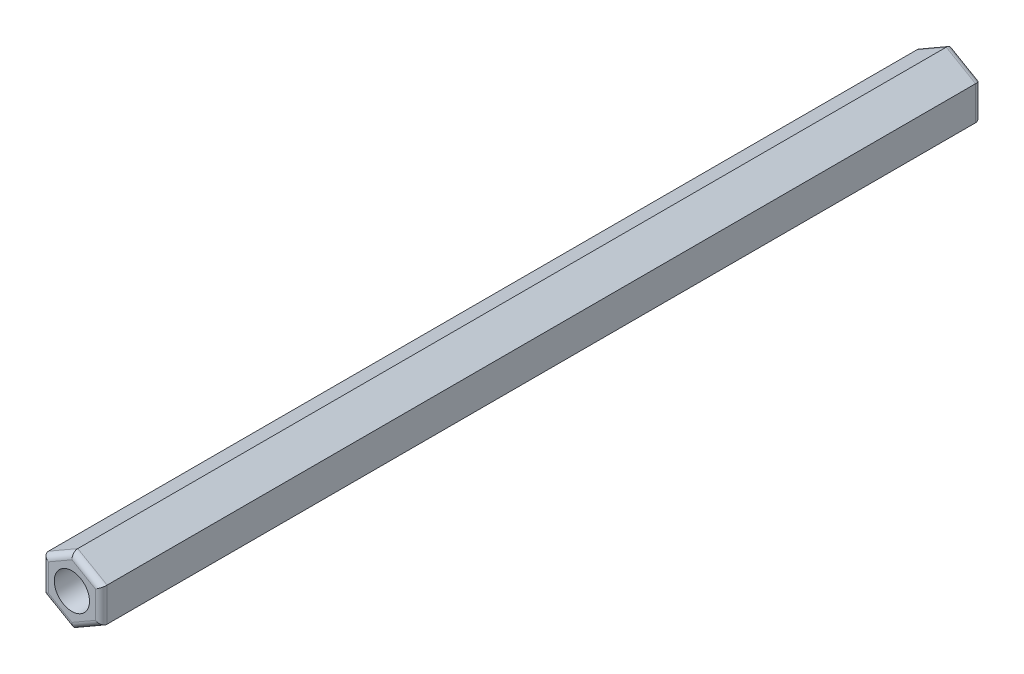
ISO-10303-21;
HEADER;
FILE_DESCRIPTION(('STEP AP214'),'2;1');
FILE_NAME('part.step','',(''),(''),'','','');
FILE_SCHEMA(('AUTOMOTIVE_DESIGN { 1 0 10303 214 1 1 1 1 }'));
ENDSEC;
DATA;
#1=APPLICATION_CONTEXT('core data for automotive mechanical design processes');
#2=APPLICATION_PROTOCOL_DEFINITION('international standard','automotive_design',2000,#1);
#3=PRODUCT_CONTEXT('',#1,'mechanical');
#4=PRODUCT('Part','Part','',(#3));
#5=PRODUCT_RELATED_PRODUCT_CATEGORY('part','',(#4));
#6=PRODUCT_DEFINITION_FORMATION('','',#4);
#7=PRODUCT_DEFINITION_CONTEXT('part definition',#1,'design');
#8=PRODUCT_DEFINITION('design','',#6,#7);
#9=PRODUCT_DEFINITION_SHAPE('','',#8);
#10=(LENGTH_UNIT() NAMED_UNIT(*) SI_UNIT(.MILLI.,.METRE.));
#11=(NAMED_UNIT(*) PLANE_ANGLE_UNIT() SI_UNIT($,.RADIAN.));
#12=(NAMED_UNIT(*) SI_UNIT($,.STERADIAN.) SOLID_ANGLE_UNIT());
#13=UNCERTAINTY_MEASURE_WITH_UNIT(LENGTH_MEASURE(1.E-05),#10,'distance_accuracy_value','');
#14=(GEOMETRIC_REPRESENTATION_CONTEXT(3) GLOBAL_UNCERTAINTY_ASSIGNED_CONTEXT((#13)) GLOBAL_UNIT_ASSIGNED_CONTEXT((#10,
#11,#12)) REPRESENTATION_CONTEXT('',''));
#15=CARTESIAN_POINT('',(0.,0.,0.));
#16=DIRECTION('',(0.,0.,1.));
#17=DIRECTION('',(1.,0.,0.));
#18=AXIS2_PLACEMENT_3D('',#15,#16,#17);
#19=CARTESIAN_POINT('',(-67.50212267549,1.44337567297406,75.));
#20=DIRECTION('',(1.,0.,0.));
#21=DIRECTION('',(0.,0.,-1.));
#22=AXIS2_PLACEMENT_3D('',#19,#20,#21);
#23=PLANE('',#22);
#24=DIRECTION('',(0.,0.,-1.));
#25=VECTOR('',#24,1.);
#26=CARTESIAN_POINT('',(-67.50212267549,-1.44337567297407,75.));
#27=LINE('',#26,#25);
#28=CARTESIAN_POINT('',(-67.50212267549,-1.44337567297407,74.5));
#29=VERTEX_POINT('',#28);
#30=CARTESIAN_POINT('',(-67.50212267549,-1.44337567297407,0.5));
#31=VERTEX_POINT('',#30);
#32=EDGE_CURVE('E152',#29,#31,#27,.T.);
#33=ORIENTED_EDGE('',*,*,#32,.T.);
#34=DIRECTION('',(0.,-1.,0.));
#35=VECTOR('',#34,1.);
#36=CARTESIAN_POINT('',(-67.50212267549,1.44337567297406,0.5));
#37=LINE('',#36,#35);
#38=CARTESIAN_POINT('',(-67.50212267549,1.44337567297406,0.5));
#39=VERTEX_POINT('',#38);
#40=EDGE_CURVE('E149',#31,#39,#37,.F.);
#41=ORIENTED_EDGE('',*,*,#40,.T.);
#42=DIRECTION('',(0.,0.,-1.));
#43=VECTOR('',#42,1.);
#44=CARTESIAN_POINT('',(-67.50212267549,1.44337567297406,75.));
#45=LINE('',#44,#43);
#46=CARTESIAN_POINT('',(-67.50212267549,1.44337567297406,74.5));
#47=VERTEX_POINT('',#46);
#48=EDGE_CURVE('E146',#47,#39,#45,.T.);
#49=ORIENTED_EDGE('',*,*,#48,.F.);
#50=DIRECTION('',(0.,-1.,0.));
#51=VECTOR('',#50,1.);
#52=CARTESIAN_POINT('',(-67.50212267549,-1.44337567297407,74.5));
#53=LINE('',#52,#51);
#54=EDGE_CURVE('E206',#47,#29,#53,.T.);
#55=ORIENTED_EDGE('',*,*,#54,.T.);
#56=EDGE_LOOP('',(#33,#41,#49,#55));
#57=FACE_BOUND('',#56,.T.);
#58=ADVANCED_FACE('F32',(#57),#23,.T.);
#59=CARTESIAN_POINT('',(-70.00212267549,2.88675134594811,75.));
#60=DIRECTION('',(0.5,0.866025403784439,0.));
#61=DIRECTION('',(-0.866025403784439,0.5,0.));
#62=AXIS2_PLACEMENT_3D('',#59,#60,#61);
#63=PLANE('',#62);
#64=ORIENTED_EDGE('',*,*,#48,.T.);
#65=DIRECTION('',(0.866025403784439,-0.5,0.));
#66=VECTOR('',#65,1.);
#67=CARTESIAN_POINT('',(-70.00212267549,2.88675134594811,0.5));
#68=LINE('',#67,#66);
#69=CARTESIAN_POINT('',(-70.00212267549,2.88675134594811,0.5));
#70=VERTEX_POINT('',#69);
#71=EDGE_CURVE('E191',#39,#70,#68,.F.);
#72=ORIENTED_EDGE('',*,*,#71,.T.);
#73=DIRECTION('',(0.,0.,-1.));
#74=VECTOR('',#73,1.);
#75=CARTESIAN_POINT('',(-70.00212267549,2.88675134594811,75.));
#76=LINE('',#75,#74);
#77=CARTESIAN_POINT('',(-70.00212267549,2.88675134594811,74.5));
#78=VERTEX_POINT('',#77);
#79=EDGE_CURVE('E255',#78,#70,#76,.T.);
#80=ORIENTED_EDGE('',*,*,#79,.F.);
#81=DIRECTION('',(0.866025403784439,-0.5,0.));
#82=VECTOR('',#81,1.);
#83=CARTESIAN_POINT('',(-67.50212267549,1.44337567297406,74.5));
#84=LINE('',#83,#82);
#85=EDGE_CURVE('E197',#78,#47,#84,.T.);
#86=ORIENTED_EDGE('',*,*,#85,.T.);
#87=EDGE_LOOP('',(#64,#72,#80,#86));
#88=FACE_BOUND('',#87,.T.);
#89=ADVANCED_FACE('F284',(#88),#63,.T.);
#90=CARTESIAN_POINT('',(-72.50212267549,1.44337567297405,75.));
#91=DIRECTION('',(-0.5,0.866025403784438,0.));
#92=DIRECTION('',(-0.866025403784439,-0.5,0.));
#93=AXIS2_PLACEMENT_3D('',#90,#91,#92);
#94=PLANE('',#93);
#95=ORIENTED_EDGE('',*,*,#79,.T.);
#96=DIRECTION('',(0.866025403784439,0.5,0.));
#97=VECTOR('',#96,1.);
#98=CARTESIAN_POINT('',(-72.50212267549,1.44337567297405,0.5));
#99=LINE('',#98,#97);
#100=CARTESIAN_POINT('',(-72.50212267549,1.44337567297405,0.5));
#101=VERTEX_POINT('',#100);
#102=EDGE_CURVE('E231',#70,#101,#99,.F.);
#103=ORIENTED_EDGE('',*,*,#102,.T.);
#104=DIRECTION('',(0.,0.,-1.));
#105=VECTOR('',#104,1.);
#106=CARTESIAN_POINT('',(-72.50212267549,1.44337567297405,75.));
#107=LINE('',#106,#105);
#108=CARTESIAN_POINT('',(-72.50212267549,1.44337567297405,74.5));
#109=VERTEX_POINT('',#108);
#110=EDGE_CURVE('E253',#109,#101,#107,.T.);
#111=ORIENTED_EDGE('',*,*,#110,.F.);
#112=DIRECTION('',(0.866025403784439,0.5,0.));
#113=VECTOR('',#112,1.);
#114=CARTESIAN_POINT('',(-70.00212267549,2.88675134594811,74.5));
#115=LINE('',#114,#113);
#116=EDGE_CURVE('E234',#109,#78,#115,.T.);
#117=ORIENTED_EDGE('',*,*,#116,.T.);
#118=EDGE_LOOP('',(#95,#103,#111,#117));
#119=FACE_BOUND('',#118,.T.);
#120=ADVANCED_FACE('F290',(#119),#94,.T.);
#121=CARTESIAN_POINT('',(-72.50212267549,-1.44337567297407,75.));
#122=DIRECTION('',(-1.,0.,0.));
#123=DIRECTION('',(0.,0.,1.));
#124=AXIS2_PLACEMENT_3D('',#121,#122,#123);
#125=PLANE('',#124);
#126=ORIENTED_EDGE('',*,*,#110,.T.);
#127=DIRECTION('',(0.,1.,0.));
#128=VECTOR('',#127,1.);
#129=CARTESIAN_POINT('',(-72.50212267549,-1.44337567297407,0.5));
#130=LINE('',#129,#128);
#131=CARTESIAN_POINT('',(-72.50212267549,-1.44337567297407,0.5));
#132=VERTEX_POINT('',#131);
#133=EDGE_CURVE('E201',#101,#132,#130,.F.);
#134=ORIENTED_EDGE('',*,*,#133,.T.);
#135=DIRECTION('',(0.,0.,-1.));
#136=VECTOR('',#135,1.);
#137=CARTESIAN_POINT('',(-72.50212267549,-1.44337567297407,75.));
#138=LINE('',#137,#136);
#139=CARTESIAN_POINT('',(-72.50212267549,-1.44337567297407,74.5));
#140=VERTEX_POINT('',#139);
#141=EDGE_CURVE('E250',#140,#132,#138,.T.);
#142=ORIENTED_EDGE('',*,*,#141,.F.);
#143=DIRECTION('',(0.,1.,0.));
#144=VECTOR('',#143,1.);
#145=CARTESIAN_POINT('',(-72.50212267549,1.44337567297405,74.5));
#146=LINE('',#145,#144);
#147=EDGE_CURVE('E226',#140,#109,#146,.T.);
#148=ORIENTED_EDGE('',*,*,#147,.T.);
#149=EDGE_LOOP('',(#126,#134,#142,#148));
#150=FACE_BOUND('',#149,.T.);
#151=ADVANCED_FACE('F341',(#150),#125,.T.);
#152=CARTESIAN_POINT('',(-70.00212267549,-2.88675134594813,75.));
#153=DIRECTION('',(-0.499999999999999,-0.866025403784439,0.));
#154=DIRECTION('',(0.866025403784439,-0.499999999999999,0.));
#155=AXIS2_PLACEMENT_3D('',#152,#153,#154);
#156=PLANE('',#155);
#157=ORIENTED_EDGE('',*,*,#141,.T.);
#158=DIRECTION('',(-0.866025403784439,0.499999999999999,0.));
#159=VECTOR('',#158,1.);
#160=CARTESIAN_POINT('',(-70.00212267549,-2.88675134594813,0.5));
#161=LINE('',#160,#159);
#162=CARTESIAN_POINT('',(-70.00212267549,-2.88675134594813,0.5));
#163=VERTEX_POINT('',#162);
#164=EDGE_CURVE('E199',#132,#163,#161,.F.);
#165=ORIENTED_EDGE('',*,*,#164,.T.);
#166=DIRECTION('',(0.,0.,-1.));
#167=VECTOR('',#166,1.);
#168=CARTESIAN_POINT('',(-70.00212267549,-2.88675134594813,75.));
#169=LINE('',#168,#167);
#170=CARTESIAN_POINT('',(-70.00212267549,-2.88675134594813,74.5));
#171=VERTEX_POINT('',#170);
#172=EDGE_CURVE('E247',#171,#163,#169,.T.);
#173=ORIENTED_EDGE('',*,*,#172,.F.);
#174=DIRECTION('',(-0.866025403784439,0.499999999999999,0.));
#175=VECTOR('',#174,1.);
#176=CARTESIAN_POINT('',(-72.50212267549,-1.44337567297407,74.5));
#177=LINE('',#176,#175);
#178=EDGE_CURVE('E196',#171,#140,#177,.T.);
#179=ORIENTED_EDGE('',*,*,#178,.T.);
#180=EDGE_LOOP('',(#157,#165,#173,#179));
#181=FACE_BOUND('',#180,.T.);
#182=ADVANCED_FACE('F280',(#181),#156,.T.);
#183=CARTESIAN_POINT('',(-67.50212267549,-1.44337567297407,75.));
#184=DIRECTION('',(0.500000000000001,-0.866025403784438,0.));
#185=DIRECTION('',(0.866025403784438,0.500000000000001,0.));
#186=AXIS2_PLACEMENT_3D('',#183,#184,#185);
#187=PLANE('',#186);
#188=ORIENTED_EDGE('',*,*,#172,.T.);
#189=DIRECTION('',(-0.866025403784438,-0.500000000000001,0.));
#190=VECTOR('',#189,1.);
#191=CARTESIAN_POINT('',(-67.50212267549,-1.44337567297407,0.5));
#192=LINE('',#191,#190);
#193=EDGE_CURVE('E211',#163,#31,#192,.F.);
#194=ORIENTED_EDGE('',*,*,#193,.T.);
#195=ORIENTED_EDGE('',*,*,#32,.F.);
#196=DIRECTION('',(-0.866025403784438,-0.500000000000001,0.));
#197=VECTOR('',#196,1.);
#198=CARTESIAN_POINT('',(-70.00212267549,-2.88675134594813,74.5));
#199=LINE('',#198,#197);
#200=EDGE_CURVE('E209',#29,#171,#199,.T.);
#201=ORIENTED_EDGE('',*,*,#200,.T.);
#202=EDGE_LOOP('',(#188,#194,#195,#201));
#203=FACE_BOUND('',#202,.T.);
#204=ADVANCED_FACE('F273',(#203),#187,.T.);
#205=CARTESIAN_POINT('',(0.,0.,75.));
#206=DIRECTION('',(0.,0.,-1.));
#207=DIRECTION('',(-1.,0.,0.));
#208=AXIS2_PLACEMENT_3D('',#205,#206,#207);
#209=PLANE('',#208);
#210=CARTESIAN_POINT('',(-70.00212267549,0.,75.));
#211=DIRECTION('',(0.,0.,1.));
#212=DIRECTION('',(1.,0.,0.));
#213=AXIS2_PLACEMENT_3D('',#210,#211,#212);
#214=CIRCLE('',#213,1.5);
#215=CARTESIAN_POINT('',(-68.50212267549,0.,75.));
#216=VERTEX_POINT('',#215);
#217=EDGE_CURVE('E258',#216,#216,#214,.T.);
#218=ORIENTED_EDGE('',*,*,#217,.F.);
#219=EDGE_LOOP('',(#218));
#220=FACE_BOUND('',#219,.T.);
#221=DIRECTION('',(0.866025403784439,-0.5,0.));
#222=VECTOR('',#221,1.);
#223=CARTESIAN_POINT('',(-70.25212267549,2.45373864405589,75.));
#224=LINE('',#223,#222);
#225=CARTESIAN_POINT('',(-68.00212267549,1.15470053837924,75.));
#226=VERTEX_POINT('',#225);
#227=CARTESIAN_POINT('',(-70.00212267549,2.30940107675849,75.));
#228=VERTEX_POINT('',#227);
#229=EDGE_CURVE('E56',#226,#228,#224,.F.);
#230=ORIENTED_EDGE('',*,*,#229,.T.);
#231=DIRECTION('',(0.866025403784439,0.5,0.));
#232=VECTOR('',#231,1.);
#233=CARTESIAN_POINT('',(-72.25212267549,1.01036297108183,75.));
#234=LINE('',#233,#232);
#235=CARTESIAN_POINT('',(-72.00212267549,1.15470053837923,75.));
#236=VERTEX_POINT('',#235);
#237=EDGE_CURVE('E11',#228,#236,#234,.F.);
#238=ORIENTED_EDGE('',*,*,#237,.T.);
#239=DIRECTION('',(0.,1.,0.));
#240=VECTOR('',#239,1.);
#241=CARTESIAN_POINT('',(-72.00212267549,-1.44337567297407,75.));
#242=LINE('',#241,#240);
#243=CARTESIAN_POINT('',(-72.00212267549,-1.15470053837925,75.));
#244=VERTEX_POINT('',#243);
#245=EDGE_CURVE('E41',#236,#244,#242,.F.);
#246=ORIENTED_EDGE('',*,*,#245,.T.);
#247=DIRECTION('',(-0.866025403784439,0.499999999999999,0.));
#248=VECTOR('',#247,1.);
#249=CARTESIAN_POINT('',(-69.75212267549,-2.45373864405591,75.));
#250=LINE('',#249,#248);
#251=CARTESIAN_POINT('',(-70.00212267549,-2.3094010767585,75.));
#252=VERTEX_POINT('',#251);
#253=EDGE_CURVE('E217',#244,#252,#250,.F.);
#254=ORIENTED_EDGE('',*,*,#253,.T.);
#255=DIRECTION('',(-0.866025403784438,-0.500000000000001,0.));
#256=VECTOR('',#255,1.);
#257=CARTESIAN_POINT('',(-67.75212267549,-1.01036297108185,75.));
#258=LINE('',#257,#256);
#259=CARTESIAN_POINT('',(-68.00212267549,-1.15470053837926,75.));
#260=VERTEX_POINT('',#259);
#261=EDGE_CURVE('E213',#252,#260,#258,.F.);
#262=ORIENTED_EDGE('',*,*,#261,.T.);
#263=DIRECTION('',(0.,-1.,0.));
#264=VECTOR('',#263,1.);
#265=CARTESIAN_POINT('',(-68.00212267549,1.44337567297406,75.));
#266=LINE('',#265,#264);
#267=EDGE_CURVE('E215',#260,#226,#266,.F.);
#268=ORIENTED_EDGE('',*,*,#267,.T.);
#269=EDGE_LOOP('',(#230,#238,#246,#254,#262,#268));
#270=FACE_BOUND('',#269,.T.);
#271=ADVANCED_FACE('F219',(#220,#270),#209,.F.);
#272=CARTESIAN_POINT('',(0.,0.,0.));
#273=DIRECTION('',(0.,0.,-1.));
#274=DIRECTION('',(-1.,0.,0.));
#275=AXIS2_PLACEMENT_3D('',#272,#273,#274);
#276=PLANE('',#275);
#277=CARTESIAN_POINT('',(-70.00212267549,0.,0.));
#278=DIRECTION('',(0.,0.,1.));
#279=DIRECTION('',(1.,0.,0.));
#280=AXIS2_PLACEMENT_3D('',#277,#278,#279);
#281=CIRCLE('',#280,1.5);
#282=CARTESIAN_POINT('',(-68.50212267549,0.,0.));
#283=VERTEX_POINT('',#282);
#284=EDGE_CURVE('E161',#283,#283,#281,.T.);
#285=ORIENTED_EDGE('',*,*,#284,.T.);
#286=EDGE_LOOP('',(#285));
#287=FACE_BOUND('',#286,.T.);
#288=DIRECTION('',(0.,1.,0.));
#289=VECTOR('',#288,1.);
#290=CARTESIAN_POINT('',(-72.00212267549,0.,0.));
#291=LINE('',#290,#289);
#292=CARTESIAN_POINT('',(-72.00212267549,-1.15470053837926,0.));
#293=VERTEX_POINT('',#292);
#294=CARTESIAN_POINT('',(-72.00212267549,1.15470053837924,0.));
#295=VERTEX_POINT('',#294);
#296=EDGE_CURVE('E241',#293,#295,#291,.T.);
#297=ORIENTED_EDGE('',*,*,#296,.T.);
#298=DIRECTION('',(0.866025403784439,0.5,0.));
#299=VECTOR('',#298,1.);
#300=CARTESIAN_POINT('',(-18.5005306688725,32.0438590854734,0.));
#301=LINE('',#300,#299);
#302=CARTESIAN_POINT('',(-70.00212267549,2.30940107675849,0.));
#303=VERTEX_POINT('',#302);
#304=EDGE_CURVE('E239',#295,#303,#301,.T.);
#305=ORIENTED_EDGE('',*,*,#304,.T.);
#306=DIRECTION('',(0.866025403784439,-0.5,0.));
#307=VECTOR('',#306,1.);
#308=CARTESIAN_POINT('',(-16.5005306688725,-28.5797574703356,0.));
#309=LINE('',#308,#307);
#310=CARTESIAN_POINT('',(-68.00212267549,1.15470053837924,0.));
#311=VERTEX_POINT('',#310);
#312=EDGE_CURVE('E130',#303,#311,#309,.T.);
#313=ORIENTED_EDGE('',*,*,#312,.T.);
#314=DIRECTION('',(0.,-1.,0.));
#315=VECTOR('',#314,1.);
#316=CARTESIAN_POINT('',(-68.00212267549,0.,0.));
#317=LINE('',#316,#315);
#318=CARTESIAN_POINT('',(-68.00212267549,-1.15470053837925,0.));
#319=VERTEX_POINT('',#318);
#320=EDGE_CURVE('E123',#311,#319,#317,.T.);
#321=ORIENTED_EDGE('',*,*,#320,.T.);
#322=DIRECTION('',(-0.866025403784438,-0.500000000000001,0.));
#323=VECTOR('',#322,1.);
#324=CARTESIAN_POINT('',(-16.5005306688726,28.5797574703357,0.));
#325=LINE('',#324,#323);
#326=CARTESIAN_POINT('',(-70.00212267549,-2.30940107675851,0.));
#327=VERTEX_POINT('',#326);
#328=EDGE_CURVE('E126',#319,#327,#325,.T.);
#329=ORIENTED_EDGE('',*,*,#328,.T.);
#330=DIRECTION('',(-0.866025403784439,0.499999999999999,0.));
#331=VECTOR('',#330,1.);
#332=CARTESIAN_POINT('',(-18.5005306688724,-32.0438590854734,0.));
#333=LINE('',#332,#331);
#334=EDGE_CURVE('E135',#327,#293,#333,.T.);
#335=ORIENTED_EDGE('',*,*,#334,.T.);
#336=EDGE_LOOP('',(#297,#305,#313,#321,#329,#335));
#337=FACE_BOUND('',#336,.T.);
#338=ADVANCED_FACE('F125',(#287,#337),#276,.T.);
#339=CARTESIAN_POINT('',(-16.5005306688726,28.5797574703357,0.5));
#340=DIRECTION('',(-0.866025403784438,-0.500000000000001,0.));
#341=DIRECTION('',(0.500000000000001,-0.866025403784438,0.));
#342=AXIS2_PLACEMENT_3D('',#339,#340,#341);
#343=CYLINDRICAL_SURFACE('',#342,0.5);
#344=CARTESIAN_POINT('',(-68.00212267549,-1.15470053837925,0.5));
#345=DIRECTION('',(-0.5,-0.866025403784439,0.));
#346=DIRECTION('',(-0.866025403784439,0.5,0.));
#347=AXIS2_PLACEMENT_3D('',#344,#345,#346);
#348=ELLIPSE('',#347,0.577350269189626,0.5);
#349=EDGE_CURVE('E141',#31,#319,#348,.F.);
#350=ORIENTED_EDGE('',*,*,#349,.F.);
#351=ORIENTED_EDGE('',*,*,#193,.F.);
#352=CARTESIAN_POINT('',(-70.00212267549,-2.3094010767585,0.5));
#353=DIRECTION('',(-1.,0.,0.));
#354=DIRECTION('',(0.,-1.,0.));
#355=AXIS2_PLACEMENT_3D('',#352,#353,#354);
#356=ELLIPSE('',#355,0.577350269189626,0.5);
#357=EDGE_CURVE('E144',#327,#163,#356,.T.);
#358=ORIENTED_EDGE('',*,*,#357,.F.);
#359=ORIENTED_EDGE('',*,*,#328,.F.);
#360=EDGE_LOOP('',(#350,#351,#358,#359));
#361=FACE_BOUND('',#360,.T.);
#362=ADVANCED_FACE('F139',(#361),#343,.T.);
#363=CARTESIAN_POINT('',(-18.5005306688724,-32.0438590854734,0.5));
#364=DIRECTION('',(-0.866025403784439,0.499999999999999,0.));
#365=DIRECTION('',(-0.499999999999999,-0.866025403784439,0.));
#366=AXIS2_PLACEMENT_3D('',#363,#364,#365);
#367=CYLINDRICAL_SURFACE('',#366,0.5);
#368=ORIENTED_EDGE('',*,*,#357,.T.);
#369=ORIENTED_EDGE('',*,*,#164,.F.);
#370=CARTESIAN_POINT('',(-72.00212267549,-1.15470053837926,0.5));
#371=DIRECTION('',(-0.500000000000001,0.866025403784438,0.));
#372=DIRECTION('',(-0.866025403784438,-0.500000000000001,0.));
#373=AXIS2_PLACEMENT_3D('',#370,#371,#372);
#374=ELLIPSE('',#373,0.577350269189626,0.5);
#375=EDGE_CURVE('E150',#293,#132,#374,.T.);
#376=ORIENTED_EDGE('',*,*,#375,.F.);
#377=ORIENTED_EDGE('',*,*,#334,.F.);
#378=EDGE_LOOP('',(#368,#369,#376,#377));
#379=FACE_BOUND('',#378,.T.);
#380=ADVANCED_FACE('F305',(#379),#367,.T.);
#381=CARTESIAN_POINT('',(-68.00212267549,0.,0.5));
#382=DIRECTION('',(0.,-1.,0.));
#383=DIRECTION('',(0.,0.,-1.));
#384=AXIS2_PLACEMENT_3D('',#381,#382,#383);
#385=CYLINDRICAL_SURFACE('',#384,0.5);
#386=ORIENTED_EDGE('',*,*,#349,.T.);
#387=ORIENTED_EDGE('',*,*,#320,.F.);
#388=CARTESIAN_POINT('',(-68.00212267549,1.15470053837925,0.5));
#389=DIRECTION('',(0.5,-0.866025403784439,0.));
#390=DIRECTION('',(-0.866025403784439,-0.5,0.));
#391=AXIS2_PLACEMENT_3D('',#388,#389,#390);
#392=ELLIPSE('',#391,0.577350269189626,0.5);
#393=EDGE_CURVE('E155',#39,#311,#392,.F.);
#394=ORIENTED_EDGE('',*,*,#393,.F.);
#395=ORIENTED_EDGE('',*,*,#40,.F.);
#396=EDGE_LOOP('',(#386,#387,#394,#395));
#397=FACE_BOUND('',#396,.T.);
#398=ADVANCED_FACE('F148',(#397),#385,.T.);
#399=CARTESIAN_POINT('',(-72.00212267549,0.,0.5));
#400=DIRECTION('',(0.,1.,0.));
#401=DIRECTION('',(0.,0.,1.));
#402=AXIS2_PLACEMENT_3D('',#399,#400,#401);
#403=CYLINDRICAL_SURFACE('',#402,0.5);
#404=ORIENTED_EDGE('',*,*,#375,.T.);
#405=ORIENTED_EDGE('',*,*,#133,.F.);
#406=CARTESIAN_POINT('',(-72.00212267549,1.15470053837923,0.5));
#407=DIRECTION('',(0.5,0.866025403784439,0.));
#408=DIRECTION('',(-0.866025403784439,0.5,0.));
#409=AXIS2_PLACEMENT_3D('',#406,#407,#408);
#410=ELLIPSE('',#409,0.577350269189626,0.5);
#411=EDGE_CURVE('E180',#295,#101,#410,.T.);
#412=ORIENTED_EDGE('',*,*,#411,.F.);
#413=ORIENTED_EDGE('',*,*,#296,.F.);
#414=EDGE_LOOP('',(#404,#405,#412,#413));
#415=FACE_BOUND('',#414,.T.);
#416=ADVANCED_FACE('F299',(#415),#403,.T.);
#417=CARTESIAN_POINT('',(-16.5005306688725,-28.5797574703356,0.5));
#418=DIRECTION('',(0.866025403784439,-0.5,0.));
#419=DIRECTION('',(0.5,0.866025403784439,0.));
#420=AXIS2_PLACEMENT_3D('',#417,#418,#419);
#421=CYLINDRICAL_SURFACE('',#420,0.5);
#422=ORIENTED_EDGE('',*,*,#393,.T.);
#423=ORIENTED_EDGE('',*,*,#312,.F.);
#424=CARTESIAN_POINT('',(-70.00212267549,2.30940107675848,0.5));
#425=DIRECTION('',(1.,0.,0.));
#426=DIRECTION('',(0.,-1.,0.));
#427=AXIS2_PLACEMENT_3D('',#424,#425,#426);
#428=ELLIPSE('',#427,0.577350269189626,0.5);
#429=EDGE_CURVE('E175',#70,#303,#428,.F.);
#430=ORIENTED_EDGE('',*,*,#429,.F.);
#431=ORIENTED_EDGE('',*,*,#71,.F.);
#432=EDGE_LOOP('',(#422,#423,#430,#431));
#433=FACE_BOUND('',#432,.T.);
#434=ADVANCED_FACE('F190',(#433),#421,.T.);
#435=CARTESIAN_POINT('',(-18.5005306688725,32.0438590854734,0.5));
#436=DIRECTION('',(0.866025403784439,0.5,0.));
#437=DIRECTION('',(-0.5,0.866025403784438,0.));
#438=AXIS2_PLACEMENT_3D('',#435,#436,#437);
#439=CYLINDRICAL_SURFACE('',#438,0.5);
#440=ORIENTED_EDGE('',*,*,#411,.T.);
#441=ORIENTED_EDGE('',*,*,#102,.F.);
#442=ORIENTED_EDGE('',*,*,#429,.T.);
#443=ORIENTED_EDGE('',*,*,#304,.F.);
#444=EDGE_LOOP('',(#440,#441,#442,#443));
#445=FACE_BOUND('',#444,.T.);
#446=ADVANCED_FACE('F294',(#445),#439,.T.);
#447=CARTESIAN_POINT('',(-67.75212267549,-1.01036297108185,74.5));
#448=DIRECTION('',(0.866025403784438,0.500000000000001,0.));
#449=DIRECTION('',(-0.500000000000001,0.866025403784438,0.));
#450=AXIS2_PLACEMENT_3D('',#447,#448,#449);
#451=CYLINDRICAL_SURFACE('',#450,0.5);
#452=CARTESIAN_POINT('',(-68.00212267549,-1.15470053837926,74.5));
#453=DIRECTION('',(0.5,0.866025403784439,0.));
#454=DIRECTION('',(0.866025403784439,-0.5,0.));
#455=AXIS2_PLACEMENT_3D('',#452,#453,#454);
#456=ELLIPSE('',#455,0.577350269189626,0.5);
#457=EDGE_CURVE('E168',#260,#29,#456,.T.);
#458=ORIENTED_EDGE('',*,*,#457,.F.);
#459=ORIENTED_EDGE('',*,*,#261,.F.);
#460=CARTESIAN_POINT('',(-70.00212267549,-2.3094010767585,74.5));
#461=DIRECTION('',(1.,0.,0.));
#462=DIRECTION('',(0.,1.,0.));
#463=AXIS2_PLACEMENT_3D('',#460,#461,#462);
#464=ELLIPSE('',#463,0.577350269189626,0.5);
#465=EDGE_CURVE('E36',#171,#252,#464,.F.);
#466=ORIENTED_EDGE('',*,*,#465,.F.);
#467=ORIENTED_EDGE('',*,*,#200,.F.);
#468=EDGE_LOOP('',(#458,#459,#466,#467));
#469=FACE_BOUND('',#468,.T.);
#470=ADVANCED_FACE('F34',(#469),#451,.T.);
#471=CARTESIAN_POINT('',(-69.75212267549,-2.45373864405591,74.5));
#472=DIRECTION('',(0.866025403784439,-0.499999999999999,0.));
#473=DIRECTION('',(0.499999999999999,0.866025403784439,0.));
#474=AXIS2_PLACEMENT_3D('',#471,#472,#473);
#475=CYLINDRICAL_SURFACE('',#474,0.5);
#476=ORIENTED_EDGE('',*,*,#465,.T.);
#477=ORIENTED_EDGE('',*,*,#253,.F.);
#478=CARTESIAN_POINT('',(-72.00212267549,-1.15470053837925,74.5));
#479=DIRECTION('',(0.500000000000001,-0.866025403784438,0.));
#480=DIRECTION('',(0.866025403784438,0.500000000000001,0.));
#481=AXIS2_PLACEMENT_3D('',#478,#479,#480);
#482=ELLIPSE('',#481,0.577350269189626,0.5);
#483=EDGE_CURVE('E166',#140,#244,#482,.F.);
#484=ORIENTED_EDGE('',*,*,#483,.F.);
#485=ORIENTED_EDGE('',*,*,#178,.F.);
#486=EDGE_LOOP('',(#476,#477,#484,#485));
#487=FACE_BOUND('',#486,.T.);
#488=ADVANCED_FACE('F223',(#487),#475,.T.);
#489=CARTESIAN_POINT('',(-68.00212267549,1.44337567297406,74.5));
#490=DIRECTION('',(0.,1.,0.));
#491=DIRECTION('',(0.,0.,1.));
#492=AXIS2_PLACEMENT_3D('',#489,#490,#491);
#493=CYLINDRICAL_SURFACE('',#492,0.5);
#494=ORIENTED_EDGE('',*,*,#457,.T.);
#495=ORIENTED_EDGE('',*,*,#54,.F.);
#496=CARTESIAN_POINT('',(-68.00212267549,1.15470053837924,74.5));
#497=DIRECTION('',(-0.5,0.866025403784439,0.));
#498=DIRECTION('',(0.866025403784439,0.5,0.));
#499=AXIS2_PLACEMENT_3D('',#496,#497,#498);
#500=ELLIPSE('',#499,0.577350269189626,0.5);
#501=EDGE_CURVE('E163',#226,#47,#500,.T.);
#502=ORIENTED_EDGE('',*,*,#501,.F.);
#503=ORIENTED_EDGE('',*,*,#267,.F.);
#504=EDGE_LOOP('',(#494,#495,#502,#503));
#505=FACE_BOUND('',#504,.T.);
#506=ADVANCED_FACE('F319',(#505),#493,.T.);
#507=CARTESIAN_POINT('',(-72.00212267549,-1.44337567297407,74.5));
#508=DIRECTION('',(0.,-1.,0.));
#509=DIRECTION('',(0.,0.,-1.));
#510=AXIS2_PLACEMENT_3D('',#507,#508,#509);
#511=CYLINDRICAL_SURFACE('',#510,0.5);
#512=ORIENTED_EDGE('',*,*,#483,.T.);
#513=ORIENTED_EDGE('',*,*,#245,.F.);
#514=CARTESIAN_POINT('',(-72.00212267549,1.15470053837923,74.5));
#515=DIRECTION('',(-0.5,-0.866025403784439,0.));
#516=DIRECTION('',(0.866025403784439,-0.5,0.));
#517=AXIS2_PLACEMENT_3D('',#514,#515,#516);
#518=ELLIPSE('',#517,0.577350269189626,0.5);
#519=EDGE_CURVE('E49',#109,#236,#518,.F.);
#520=ORIENTED_EDGE('',*,*,#519,.F.);
#521=ORIENTED_EDGE('',*,*,#147,.F.);
#522=EDGE_LOOP('',(#512,#513,#520,#521));
#523=FACE_BOUND('',#522,.T.);
#524=ADVANCED_FACE('F225',(#523),#511,.T.);
#525=CARTESIAN_POINT('',(-70.25212267549,2.45373864405589,74.5));
#526=DIRECTION('',(-0.866025403784439,0.5,0.));
#527=DIRECTION('',(-0.5,-0.866025403784439,0.));
#528=AXIS2_PLACEMENT_3D('',#525,#526,#527);
#529=CYLINDRICAL_SURFACE('',#528,0.5);
#530=ORIENTED_EDGE('',*,*,#501,.T.);
#531=ORIENTED_EDGE('',*,*,#85,.F.);
#532=CARTESIAN_POINT('',(-70.00212267549,2.30940107675849,74.5));
#533=DIRECTION('',(-1.,0.,0.));
#534=DIRECTION('',(0.,1.,0.));
#535=AXIS2_PLACEMENT_3D('',#532,#533,#534);
#536=ELLIPSE('',#535,0.577350269189626,0.5);
#537=EDGE_CURVE('E159',#228,#78,#536,.T.);
#538=ORIENTED_EDGE('',*,*,#537,.F.);
#539=ORIENTED_EDGE('',*,*,#229,.F.);
#540=EDGE_LOOP('',(#530,#531,#538,#539));
#541=FACE_BOUND('',#540,.T.);
#542=ADVANCED_FACE('F313',(#541),#529,.T.);
#543=CARTESIAN_POINT('',(-72.25212267549,1.01036297108183,74.5));
#544=DIRECTION('',(-0.866025403784439,-0.5,0.));
#545=DIRECTION('',(0.5,-0.866025403784438,0.));
#546=AXIS2_PLACEMENT_3D('',#543,#544,#545);
#547=CYLINDRICAL_SURFACE('',#546,0.5);
#548=ORIENTED_EDGE('',*,*,#519,.T.);
#549=ORIENTED_EDGE('',*,*,#237,.F.);
#550=ORIENTED_EDGE('',*,*,#537,.T.);
#551=ORIENTED_EDGE('',*,*,#116,.F.);
#552=EDGE_LOOP('',(#548,#549,#550,#551));
#553=FACE_BOUND('',#552,.T.);
#554=ADVANCED_FACE('F268',(#553),#547,.T.);
#555=CARTESIAN_POINT('',(-70.00212267549,0.,0.));
#556=DIRECTION('',(0.,0.,1.));
#557=DIRECTION('',(1.,0.,0.));
#558=AXIS2_PLACEMENT_3D('',#555,#556,#557);
#559=CYLINDRICAL_SURFACE('',#558,1.5);
#560=ORIENTED_EDGE('',*,*,#284,.F.);
#561=EDGE_LOOP('',(#560));
#562=FACE_BOUND('',#561,.T.);
#563=ORIENTED_EDGE('',*,*,#217,.T.);
#564=EDGE_LOOP('',(#563));
#565=FACE_BOUND('',#564,.T.);
#566=ADVANCED_FACE('F265',(#562,#565),#559,.F.);
#567=CLOSED_SHELL('',(#58,#89,#120,#151,#182,#204,#271,#338,#362,#380,#398,#416,#434,#446,#470,
#488,#506,#524,#542,#554,#566));
#568=MANIFOLD_SOLID_BREP('B2',#567);
#569=ADVANCED_BREP_SHAPE_REPRESENTATION('',(#18,#568),#14);
#570=SHAPE_DEFINITION_REPRESENTATION(#9,#569);
ENDSEC;
END-ISO-10303-21;
